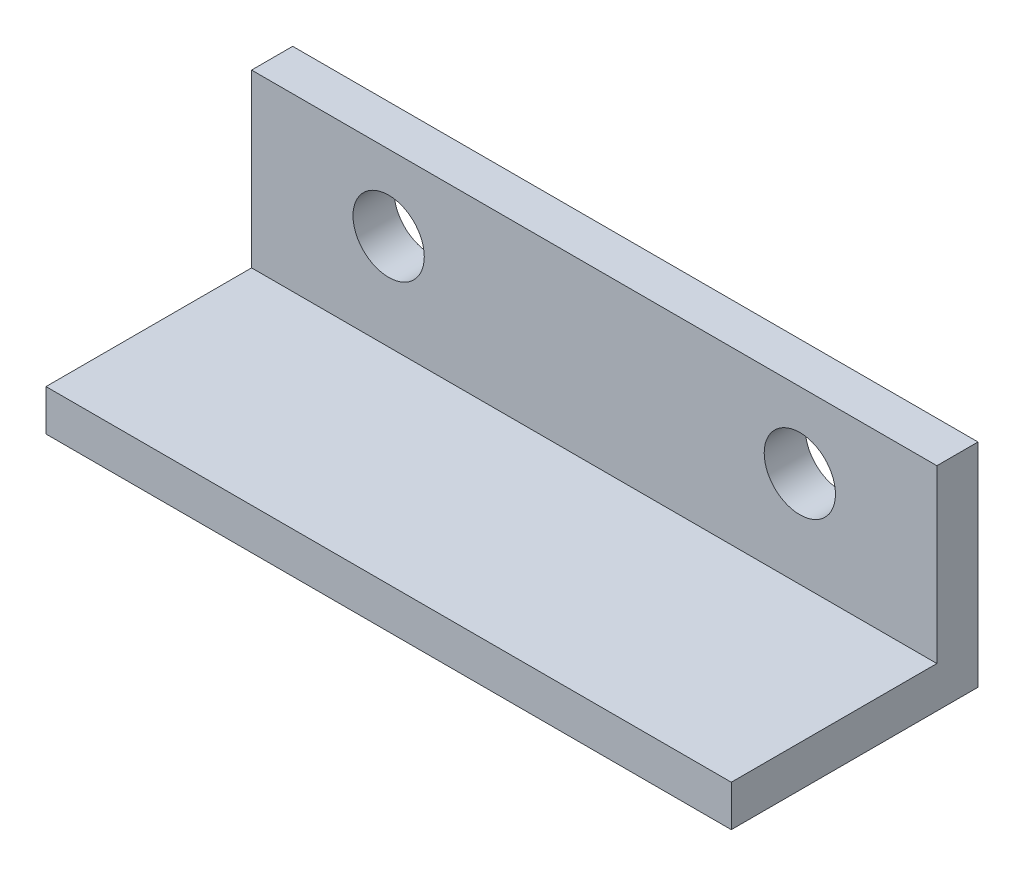
ISO-10303-21;
HEADER;
FILE_DESCRIPTION(('STEP AP214'),'2;1');
FILE_NAME('part.step','',(''),(''),'','','');
FILE_SCHEMA(('AUTOMOTIVE_DESIGN { 1 0 10303 214 1 1 1 1 }'));
ENDSEC;
DATA;
#1=APPLICATION_CONTEXT('core data for automotive mechanical design processes');
#2=APPLICATION_PROTOCOL_DEFINITION('international standard','automotive_design',2000,#1);
#3=PRODUCT_CONTEXT('',#1,'mechanical');
#4=PRODUCT('Part','Part','',(#3));
#5=PRODUCT_RELATED_PRODUCT_CATEGORY('part','',(#4));
#6=PRODUCT_DEFINITION_FORMATION('','',#4);
#7=PRODUCT_DEFINITION_CONTEXT('part definition',#1,'design');
#8=PRODUCT_DEFINITION('design','',#6,#7);
#9=PRODUCT_DEFINITION_SHAPE('','',#8);
#10=(LENGTH_UNIT() NAMED_UNIT(*) SI_UNIT(.MILLI.,.METRE.));
#11=(NAMED_UNIT(*) PLANE_ANGLE_UNIT() SI_UNIT($,.RADIAN.));
#12=(NAMED_UNIT(*) SI_UNIT($,.STERADIAN.) SOLID_ANGLE_UNIT());
#13=UNCERTAINTY_MEASURE_WITH_UNIT(LENGTH_MEASURE(1.E-05),#10,'distance_accuracy_value','');
#14=(GEOMETRIC_REPRESENTATION_CONTEXT(3) GLOBAL_UNCERTAINTY_ASSIGNED_CONTEXT((#13)) GLOBAL_UNIT_ASSIGNED_CONTEXT((#10,
#11,#12)) REPRESENTATION_CONTEXT('',''));
#15=CARTESIAN_POINT('',(0.,0.,0.));
#16=DIRECTION('',(0.,0.,1.));
#17=DIRECTION('',(1.,0.,0.));
#18=AXIS2_PLACEMENT_3D('',#15,#16,#17);
#19=CARTESIAN_POINT('',(0.,0.,0.));
#20=DIRECTION('',(0.,0.,1.));
#21=DIRECTION('',(1.,0.,0.));
#22=AXIS2_PLACEMENT_3D('',#19,#20,#21);
#23=PLANE('',#22);
#24=CARTESIAN_POINT('',(-4.34426229508198,-1.06557377049181,0.));
#25=DIRECTION('',(0.,0.,-1.));
#26=DIRECTION('',(-1.,0.,0.));
#27=AXIS2_PLACEMENT_3D('',#24,#25,#26);
#28=CIRCLE('',#27,2.59999999999999);
#29=CARTESIAN_POINT('',(-6.94426229508196,-1.06557377049181,0.));
#30=VERTEX_POINT('',#29);
#31=EDGE_CURVE('E256',#30,#30,#28,.T.);
#32=ORIENTED_EDGE('',*,*,#31,.F.);
#33=EDGE_LOOP('',(#32));
#34=FACE_BOUND('',#33,.T.);
#35=CARTESIAN_POINT('',(25.655737704918,-1.0655737704918,0.));
#36=DIRECTION('',(0.,0.,-1.));
#37=DIRECTION('',(-1.,0.,0.));
#38=AXIS2_PLACEMENT_3D('',#35,#36,#37);
#39=CIRCLE('',#38,2.59999999999999);
#40=CARTESIAN_POINT('',(23.055737704918,-1.0655737704918,0.));
#41=VERTEX_POINT('',#40);
#42=EDGE_CURVE('E249',#41,#41,#39,.T.);
#43=ORIENTED_EDGE('',*,*,#42,.F.);
#44=EDGE_LOOP('',(#43));
#45=FACE_BOUND('',#44,.T.);
#46=DIRECTION('',(-1.,0.,0.));
#47=VECTOR('',#46,1.);
#48=CARTESIAN_POINT('',(0.,4.43442622950817,0.));
#49=LINE('',#48,#47);
#50=CARTESIAN_POINT('',(35.655737704918,4.43442622950817,0.));
#51=VERTEX_POINT('',#50);
#52=CARTESIAN_POINT('',(-14.344262295082,4.43442622950817,0.));
#53=VERTEX_POINT('',#52);
#54=EDGE_CURVE('E222',#51,#53,#49,.T.);
#55=ORIENTED_EDGE('',*,*,#54,.F.);
#56=DIRECTION('',(0.,-1.,0.));
#57=VECTOR('',#56,1.);
#58=CARTESIAN_POINT('',(35.655737704918,0.,0.));
#59=LINE('',#58,#57);
#60=CARTESIAN_POINT('',(35.655737704918,-11.0655737704918,0.));
#61=VERTEX_POINT('',#60);
#62=EDGE_CURVE('E188',#51,#61,#59,.T.);
#63=ORIENTED_EDGE('',*,*,#62,.T.);
#64=DIRECTION('',(1.,0.,0.));
#65=VECTOR('',#64,1.);
#66=CARTESIAN_POINT('',(0.,-11.0655737704918,0.));
#67=LINE('',#66,#65);
#68=CARTESIAN_POINT('',(-14.344262295082,-11.0655737704918,0.));
#69=VERTEX_POINT('',#68);
#70=EDGE_CURVE('E197',#69,#61,#67,.T.);
#71=ORIENTED_EDGE('',*,*,#70,.F.);
#72=DIRECTION('',(0.,-1.,0.));
#73=VECTOR('',#72,1.);
#74=CARTESIAN_POINT('',(-14.344262295082,0.,0.));
#75=LINE('',#74,#73);
#76=EDGE_CURVE('E203',#53,#69,#75,.T.);
#77=ORIENTED_EDGE('',*,*,#76,.F.);
#78=EDGE_LOOP('',(#55,#63,#71,#77));
#79=FACE_BOUND('',#78,.T.);
#80=ADVANCED_FACE('F125',(#34,#45,#79),#23,.F.);
#81=CARTESIAN_POINT('',(-14.344262295082,0.,3.));
#82=DIRECTION('',(1.,0.,0.));
#83=DIRECTION('',(0.,1.,0.));
#84=AXIS2_PLACEMENT_3D('',#81,#82,#83);
#85=PLANE('',#84);
#86=DIRECTION('',(0.,0.,1.));
#87=VECTOR('',#86,1.);
#88=CARTESIAN_POINT('',(-14.344262295082,4.43442622950817,-12.));
#89=LINE('',#88,#87);
#90=CARTESIAN_POINT('',(-14.344262295082,4.43442622950817,3.));
#91=VERTEX_POINT('',#90);
#92=EDGE_CURVE('E141',#53,#91,#89,.T.);
#93=ORIENTED_EDGE('',*,*,#92,.F.);
#94=ORIENTED_EDGE('',*,*,#76,.T.);
#95=DIRECTION('',(0.,0.,-1.));
#96=VECTOR('',#95,1.);
#97=CARTESIAN_POINT('',(-14.344262295082,-11.0655737704918,3.));
#98=LINE('',#97,#96);
#99=CARTESIAN_POINT('',(-14.344262295082,-11.0655737704918,18.));
#100=VERTEX_POINT('',#99);
#101=EDGE_CURVE('E12',#100,#69,#98,.T.);
#102=ORIENTED_EDGE('',*,*,#101,.F.);
#103=DIRECTION('',(0.,-1.,0.));
#104=VECTOR('',#103,1.);
#105=CARTESIAN_POINT('',(-14.344262295082,-11.0655737704918,18.));
#106=LINE('',#105,#104);
#107=CARTESIAN_POINT('',(-14.344262295082,-8.06557377049181,18.));
#108=VERTEX_POINT('',#107);
#109=EDGE_CURVE('E227',#108,#100,#106,.T.);
#110=ORIENTED_EDGE('',*,*,#109,.F.);
#111=DIRECTION('',(0.,0.,-1.));
#112=VECTOR('',#111,1.);
#113=CARTESIAN_POINT('',(-14.344262295082,-8.06557377049181,18.));
#114=LINE('',#113,#112);
#115=CARTESIAN_POINT('',(-14.344262295082,-8.06557377049181,3.));
#116=VERTEX_POINT('',#115);
#117=EDGE_CURVE('E241',#108,#116,#114,.T.);
#118=ORIENTED_EDGE('',*,*,#117,.T.);
#119=DIRECTION('',(0.,-1.,0.));
#120=VECTOR('',#119,1.);
#121=CARTESIAN_POINT('',(-14.344262295082,0.,3.));
#122=LINE('',#121,#120);
#123=EDGE_CURVE('E196',#91,#116,#122,.T.);
#124=ORIENTED_EDGE('',*,*,#123,.F.);
#125=EDGE_LOOP('',(#93,#94,#102,#110,#118,#124));
#126=FACE_BOUND('',#125,.T.);
#127=ADVANCED_FACE('F275',(#126),#85,.F.);
#128=CARTESIAN_POINT('',(35.655737704918,0.,3.));
#129=DIRECTION('',(1.,0.,0.));
#130=DIRECTION('',(0.,0.,-1.));
#131=AXIS2_PLACEMENT_3D('',#128,#129,#130);
#132=PLANE('',#131);
#133=ORIENTED_EDGE('',*,*,#62,.F.);
#134=DIRECTION('',(0.,0.,1.));
#135=VECTOR('',#134,1.);
#136=CARTESIAN_POINT('',(35.655737704918,4.43442622950817,-12.));
#137=LINE('',#136,#135);
#138=CARTESIAN_POINT('',(35.655737704918,4.43442622950817,3.));
#139=VERTEX_POINT('',#138);
#140=EDGE_CURVE('E180',#51,#139,#137,.T.);
#141=ORIENTED_EDGE('',*,*,#140,.T.);
#142=DIRECTION('',(0.,-1.,0.));
#143=VECTOR('',#142,1.);
#144=CARTESIAN_POINT('',(35.655737704918,0.,3.));
#145=LINE('',#144,#143);
#146=CARTESIAN_POINT('',(35.655737704918,-8.06557377049181,3.));
#147=VERTEX_POINT('',#146);
#148=EDGE_CURVE('E149',#139,#147,#145,.T.);
#149=ORIENTED_EDGE('',*,*,#148,.T.);
#150=DIRECTION('',(0.,0.,-1.));
#151=VECTOR('',#150,1.);
#152=CARTESIAN_POINT('',(35.655737704918,-8.06557377049181,18.));
#153=LINE('',#152,#151);
#154=CARTESIAN_POINT('',(35.655737704918,-8.06557377049181,18.));
#155=VERTEX_POINT('',#154);
#156=EDGE_CURVE('E246',#155,#147,#153,.T.);
#157=ORIENTED_EDGE('',*,*,#156,.F.);
#158=DIRECTION('',(0.,1.,0.));
#159=VECTOR('',#158,1.);
#160=CARTESIAN_POINT('',(35.655737704918,-11.0655737704918,18.));
#161=LINE('',#160,#159);
#162=CARTESIAN_POINT('',(35.655737704918,-11.0655737704918,18.));
#163=VERTEX_POINT('',#162);
#164=EDGE_CURVE('E214',#163,#155,#161,.T.);
#165=ORIENTED_EDGE('',*,*,#164,.F.);
#166=DIRECTION('',(0.,0.,-1.));
#167=VECTOR('',#166,1.);
#168=CARTESIAN_POINT('',(35.655737704918,-11.0655737704918,3.));
#169=LINE('',#168,#167);
#170=EDGE_CURVE('E134',#163,#61,#169,.T.);
#171=ORIENTED_EDGE('',*,*,#170,.T.);
#172=EDGE_LOOP('',(#133,#141,#149,#157,#165,#171));
#173=FACE_BOUND('',#172,.T.);
#174=ADVANCED_FACE('F127',(#173),#132,.T.);
#175=CARTESIAN_POINT('',(0.,0.,3.));
#176=DIRECTION('',(0.,0.,1.));
#177=DIRECTION('',(1.,0.,0.));
#178=AXIS2_PLACEMENT_3D('',#175,#176,#177);
#179=PLANE('',#178);
#180=CARTESIAN_POINT('',(25.655737704918,-1.0655737704918,3.));
#181=DIRECTION('',(0.,0.,1.));
#182=DIRECTION('',(1.,0.,0.));
#183=AXIS2_PLACEMENT_3D('',#180,#181,#182);
#184=CIRCLE('',#183,2.59999999999999);
#185=CARTESIAN_POINT('',(28.255737704918,-1.0655737704918,3.));
#186=VERTEX_POINT('',#185);
#187=EDGE_CURVE('E253',#186,#186,#184,.T.);
#188=ORIENTED_EDGE('',*,*,#187,.F.);
#189=EDGE_LOOP('',(#188));
#190=FACE_BOUND('',#189,.T.);
#191=CARTESIAN_POINT('',(-4.34426229508198,-1.06557377049181,3.));
#192=DIRECTION('',(0.,0.,1.));
#193=DIRECTION('',(1.,0.,0.));
#194=AXIS2_PLACEMENT_3D('',#191,#192,#193);
#195=CIRCLE('',#194,2.59999999999999);
#196=CARTESIAN_POINT('',(-1.74426229508198,-1.06557377049181,3.));
#197=VERTEX_POINT('',#196);
#198=EDGE_CURVE('E206',#197,#197,#195,.T.);
#199=ORIENTED_EDGE('',*,*,#198,.F.);
#200=EDGE_LOOP('',(#199));
#201=FACE_BOUND('',#200,.T.);
#202=ORIENTED_EDGE('',*,*,#148,.F.);
#203=DIRECTION('',(-1.,0.,0.));
#204=VECTOR('',#203,1.);
#205=CARTESIAN_POINT('',(0.,4.43442622950817,3.));
#206=LINE('',#205,#204);
#207=EDGE_CURVE('E178',#139,#91,#206,.T.);
#208=ORIENTED_EDGE('',*,*,#207,.T.);
#209=ORIENTED_EDGE('',*,*,#123,.T.);
#210=DIRECTION('',(-1.,0.,0.));
#211=VECTOR('',#210,1.);
#212=CARTESIAN_POINT('',(-14.344262295082,-8.06557377049181,3.));
#213=LINE('',#212,#211);
#214=EDGE_CURVE('E193',#147,#116,#213,.T.);
#215=ORIENTED_EDGE('',*,*,#214,.F.);
#216=EDGE_LOOP('',(#202,#208,#209,#215));
#217=FACE_BOUND('',#216,.T.);
#218=ADVANCED_FACE('F191',(#190,#201,#217),#179,.T.);
#219=CARTESIAN_POINT('',(0.,-11.0655737704918,3.));
#220=DIRECTION('',(0.,1.,0.));
#221=DIRECTION('',(0.,0.,1.));
#222=AXIS2_PLACEMENT_3D('',#219,#220,#221);
#223=PLANE('',#222);
#224=ORIENTED_EDGE('',*,*,#70,.T.);
#225=ORIENTED_EDGE('',*,*,#170,.F.);
#226=DIRECTION('',(1.,0.,0.));
#227=VECTOR('',#226,1.);
#228=CARTESIAN_POINT('',(-14.344262295082,-11.0655737704918,18.));
#229=LINE('',#228,#227);
#230=EDGE_CURVE('E234',#100,#163,#229,.T.);
#231=ORIENTED_EDGE('',*,*,#230,.F.);
#232=ORIENTED_EDGE('',*,*,#101,.T.);
#233=EDGE_LOOP('',(#224,#225,#231,#232));
#234=FACE_BOUND('',#233,.T.);
#235=ADVANCED_FACE('F219',(#234),#223,.F.);
#236=CARTESIAN_POINT('',(-4.34426229508198,-1.06557377049181,0.));
#237=DIRECTION('',(0.,0.,-1.));
#238=DIRECTION('',(-1.,0.,0.));
#239=AXIS2_PLACEMENT_3D('',#236,#237,#238);
#240=CYLINDRICAL_SURFACE('',#239,2.59999999999999);
#241=ORIENTED_EDGE('',*,*,#31,.T.);
#242=EDGE_LOOP('',(#241));
#243=FACE_BOUND('',#242,.T.);
#244=ORIENTED_EDGE('',*,*,#198,.T.);
#245=EDGE_LOOP('',(#244));
#246=FACE_BOUND('',#245,.T.);
#247=ADVANCED_FACE('F265',(#243,#246),#240,.F.);
#248=CARTESIAN_POINT('',(25.655737704918,-1.0655737704918,0.));
#249=DIRECTION('',(0.,0.,-1.));
#250=DIRECTION('',(-1.,0.,0.));
#251=AXIS2_PLACEMENT_3D('',#248,#249,#250);
#252=CYLINDRICAL_SURFACE('',#251,2.59999999999999);
#253=ORIENTED_EDGE('',*,*,#42,.T.);
#254=EDGE_LOOP('',(#253));
#255=FACE_BOUND('',#254,.T.);
#256=ORIENTED_EDGE('',*,*,#187,.T.);
#257=EDGE_LOOP('',(#256));
#258=FACE_BOUND('',#257,.T.);
#259=ADVANCED_FACE('F288',(#255,#258),#252,.F.);
#260=CARTESIAN_POINT('',(-14.344262295082,-8.06557377049181,18.));
#261=DIRECTION('',(0.,-1.,0.));
#262=DIRECTION('',(0.,0.,-1.));
#263=AXIS2_PLACEMENT_3D('',#260,#261,#262);
#264=PLANE('',#263);
#265=ORIENTED_EDGE('',*,*,#214,.T.);
#266=ORIENTED_EDGE('',*,*,#117,.F.);
#267=DIRECTION('',(-1.,0.,0.));
#268=VECTOR('',#267,1.);
#269=CARTESIAN_POINT('',(-14.344262295082,-8.06557377049181,18.));
#270=LINE('',#269,#268);
#271=EDGE_CURVE('E239',#155,#108,#270,.T.);
#272=ORIENTED_EDGE('',*,*,#271,.F.);
#273=ORIENTED_EDGE('',*,*,#156,.T.);
#274=EDGE_LOOP('',(#265,#266,#272,#273));
#275=FACE_BOUND('',#274,.T.);
#276=ADVANCED_FACE('F291',(#275),#264,.F.);
#277=CARTESIAN_POINT('',(0.,0.,18.));
#278=DIRECTION('',(0.,0.,-1.));
#279=DIRECTION('',(-1.,0.,0.));
#280=AXIS2_PLACEMENT_3D('',#277,#278,#279);
#281=PLANE('',#280);
#282=ORIENTED_EDGE('',*,*,#109,.T.);
#283=ORIENTED_EDGE('',*,*,#230,.T.);
#284=ORIENTED_EDGE('',*,*,#164,.T.);
#285=ORIENTED_EDGE('',*,*,#271,.T.);
#286=EDGE_LOOP('',(#282,#283,#284,#285));
#287=FACE_BOUND('',#286,.T.);
#288=ADVANCED_FACE('F297',(#287),#281,.F.);
#289=CARTESIAN_POINT('',(0.,4.43442622950817,-12.));
#290=DIRECTION('',(0.,1.,0.));
#291=DIRECTION('',(0.,0.,1.));
#292=AXIS2_PLACEMENT_3D('',#289,#290,#291);
#293=PLANE('',#292);
#294=ORIENTED_EDGE('',*,*,#54,.T.);
#295=ORIENTED_EDGE('',*,*,#92,.T.);
#296=ORIENTED_EDGE('',*,*,#207,.F.);
#297=ORIENTED_EDGE('',*,*,#140,.F.);
#298=EDGE_LOOP('',(#294,#295,#296,#297));
#299=FACE_BOUND('',#298,.T.);
#300=ADVANCED_FACE('F179',(#299),#293,.T.);
#301=CLOSED_SHELL('',(#80,#127,#174,#218,#235,#247,#259,#276,#288,#300));
#302=MANIFOLD_SOLID_BREP('B2',#301);
#303=ADVANCED_BREP_SHAPE_REPRESENTATION('',(#18,#302),#14);
#304=SHAPE_DEFINITION_REPRESENTATION(#9,#303);
ENDSEC;
END-ISO-10303-21;
